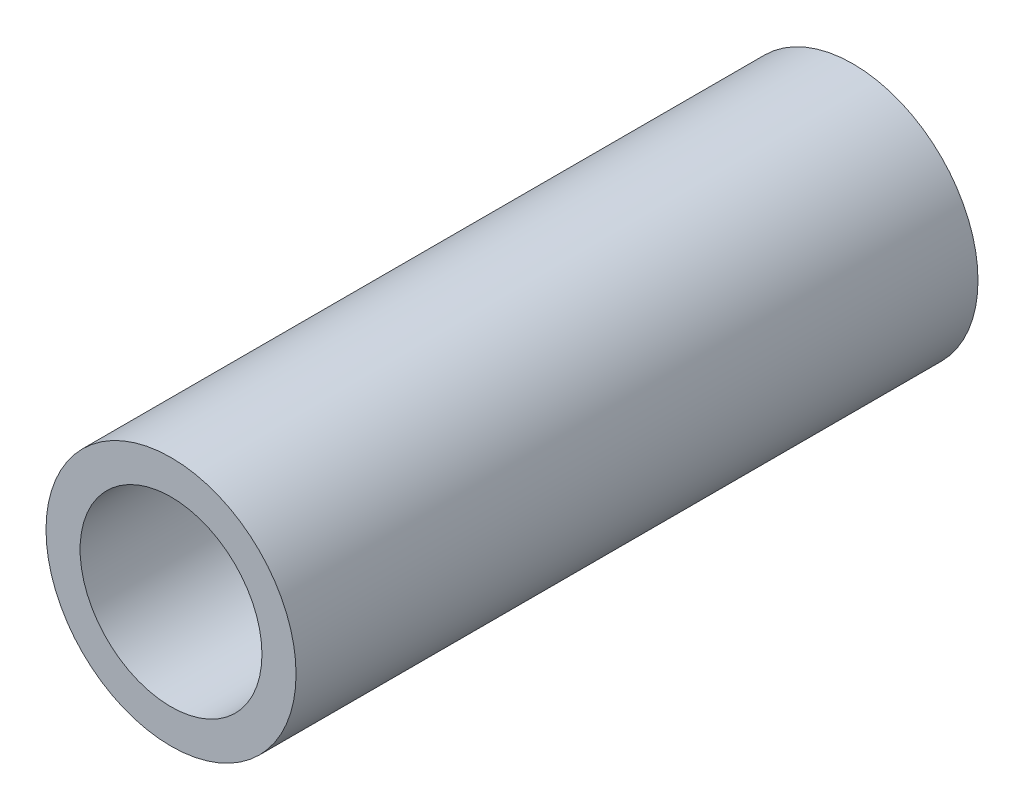
ISO-10303-21;
HEADER;
FILE_DESCRIPTION(('STEP AP214'),'2;1');
FILE_NAME('part.step','',(''),(''),'','','');
FILE_SCHEMA(('AUTOMOTIVE_DESIGN { 1 0 10303 214 1 1 1 1 }'));
ENDSEC;
DATA;
#1=APPLICATION_CONTEXT('core data for automotive mechanical design processes');
#2=APPLICATION_PROTOCOL_DEFINITION('international standard','automotive_design',2000,#1);
#3=PRODUCT_CONTEXT('',#1,'mechanical');
#4=PRODUCT('Part','Part','',(#3));
#5=PRODUCT_RELATED_PRODUCT_CATEGORY('part','',(#4));
#6=PRODUCT_DEFINITION_FORMATION('','',#4);
#7=PRODUCT_DEFINITION_CONTEXT('part definition',#1,'design');
#8=PRODUCT_DEFINITION('design','',#6,#7);
#9=PRODUCT_DEFINITION_SHAPE('','',#8);
#10=(LENGTH_UNIT() NAMED_UNIT(*) SI_UNIT(.MILLI.,.METRE.));
#11=(NAMED_UNIT(*) PLANE_ANGLE_UNIT() SI_UNIT($,.RADIAN.));
#12=(NAMED_UNIT(*) SI_UNIT($,.STERADIAN.) SOLID_ANGLE_UNIT());
#13=UNCERTAINTY_MEASURE_WITH_UNIT(LENGTH_MEASURE(1.E-05),#10,'distance_accuracy_value','');
#14=(GEOMETRIC_REPRESENTATION_CONTEXT(3) GLOBAL_UNCERTAINTY_ASSIGNED_CONTEXT((#13)) GLOBAL_UNIT_ASSIGNED_CONTEXT((#10,
#11,#12)) REPRESENTATION_CONTEXT('',''));
#15=CARTESIAN_POINT('',(0.,0.,0.));
#16=DIRECTION('',(0.,0.,1.));
#17=DIRECTION('',(1.,0.,0.));
#18=AXIS2_PLACEMENT_3D('',#15,#16,#17);
#19=CARTESIAN_POINT('',(0.,0.,30.));
#20=DIRECTION('',(0.,0.,-1.));
#21=DIRECTION('',(-1.,0.,0.));
#22=AXIS2_PLACEMENT_3D('',#19,#20,#21);
#23=CYLINDRICAL_SURFACE('',#22,5.5);
#24=CARTESIAN_POINT('',(0.,0.,30.));
#25=DIRECTION('',(0.,0.,1.));
#26=DIRECTION('',(1.,0.,0.));
#27=AXIS2_PLACEMENT_3D('',#24,#25,#26);
#28=CIRCLE('',#27,5.5);
#29=CARTESIAN_POINT('',(5.5,0.,30.));
#30=VERTEX_POINT('',#29);
#31=EDGE_CURVE('E10',#30,#30,#28,.T.);
#32=ORIENTED_EDGE('',*,*,#31,.F.);
#33=EDGE_LOOP('',(#32));
#34=FACE_BOUND('',#33,.T.);
#35=CARTESIAN_POINT('',(0.,0.,0.));
#36=DIRECTION('',(0.,0.,1.));
#37=DIRECTION('',(1.,0.,0.));
#38=AXIS2_PLACEMENT_3D('',#35,#36,#37);
#39=CIRCLE('',#38,5.5);
#40=CARTESIAN_POINT('',(5.5,0.,0.));
#41=VERTEX_POINT('',#40);
#42=EDGE_CURVE('E36',#41,#41,#39,.T.);
#43=ORIENTED_EDGE('',*,*,#42,.T.);
#44=EDGE_LOOP('',(#43));
#45=FACE_BOUND('',#44,.T.);
#46=ADVANCED_FACE('F33',(#34,#45),#23,.T.);
#47=CARTESIAN_POINT('',(0.,0.,30.));
#48=DIRECTION('',(0.,0.,1.));
#49=DIRECTION('',(1.,0.,0.));
#50=AXIS2_PLACEMENT_3D('',#47,#48,#49);
#51=PLANE('',#50);
#52=CARTESIAN_POINT('',(0.,0.,30.));
#53=DIRECTION('',(0.,0.,1.));
#54=DIRECTION('',(1.,0.,0.));
#55=AXIS2_PLACEMENT_3D('',#52,#53,#54);
#56=CIRCLE('',#55,4.);
#57=CARTESIAN_POINT('',(4.,0.,30.));
#58=VERTEX_POINT('',#57);
#59=EDGE_CURVE('E45',#58,#58,#56,.T.);
#60=ORIENTED_EDGE('',*,*,#59,.F.);
#61=EDGE_LOOP('',(#60));
#62=FACE_BOUND('',#61,.T.);
#63=ORIENTED_EDGE('',*,*,#31,.T.);
#64=EDGE_LOOP('',(#63));
#65=FACE_BOUND('',#64,.T.);
#66=ADVANCED_FACE('F60',(#62,#65),#51,.T.);
#67=CARTESIAN_POINT('',(0.,0.,0.));
#68=DIRECTION('',(0.,0.,1.));
#69=DIRECTION('',(1.,0.,0.));
#70=AXIS2_PLACEMENT_3D('',#67,#68,#69);
#71=PLANE('',#70);
#72=CARTESIAN_POINT('',(0.,0.,0.));
#73=DIRECTION('',(0.,0.,1.));
#74=DIRECTION('',(1.,0.,0.));
#75=AXIS2_PLACEMENT_3D('',#72,#73,#74);
#76=CIRCLE('',#75,4.);
#77=CARTESIAN_POINT('',(4.,0.,0.));
#78=VERTEX_POINT('',#77);
#79=EDGE_CURVE('E43',#78,#78,#76,.T.);
#80=ORIENTED_EDGE('',*,*,#79,.T.);
#81=EDGE_LOOP('',(#80));
#82=FACE_BOUND('',#81,.T.);
#83=ORIENTED_EDGE('',*,*,#42,.F.);
#84=EDGE_LOOP('',(#83));
#85=FACE_BOUND('',#84,.T.);
#86=ADVANCED_FACE('F51',(#82,#85),#71,.F.);
#87=CARTESIAN_POINT('',(0.,0.,0.));
#88=DIRECTION('',(0.,0.,1.));
#89=DIRECTION('',(1.,0.,0.));
#90=AXIS2_PLACEMENT_3D('',#87,#88,#89);
#91=CYLINDRICAL_SURFACE('',#90,4.);
#92=ORIENTED_EDGE('',*,*,#79,.F.);
#93=EDGE_LOOP('',(#92));
#94=FACE_BOUND('',#93,.T.);
#95=ORIENTED_EDGE('',*,*,#59,.T.);
#96=EDGE_LOOP('',(#95));
#97=FACE_BOUND('',#96,.T.);
#98=ADVANCED_FACE('F54',(#94,#97),#91,.F.);
#99=CLOSED_SHELL('',(#46,#66,#86,#98));
#100=MANIFOLD_SOLID_BREP('B2',#99);
#101=ADVANCED_BREP_SHAPE_REPRESENTATION('',(#18,#100),#14);
#102=SHAPE_DEFINITION_REPRESENTATION(#9,#101);
ENDSEC;
END-ISO-10303-21;
